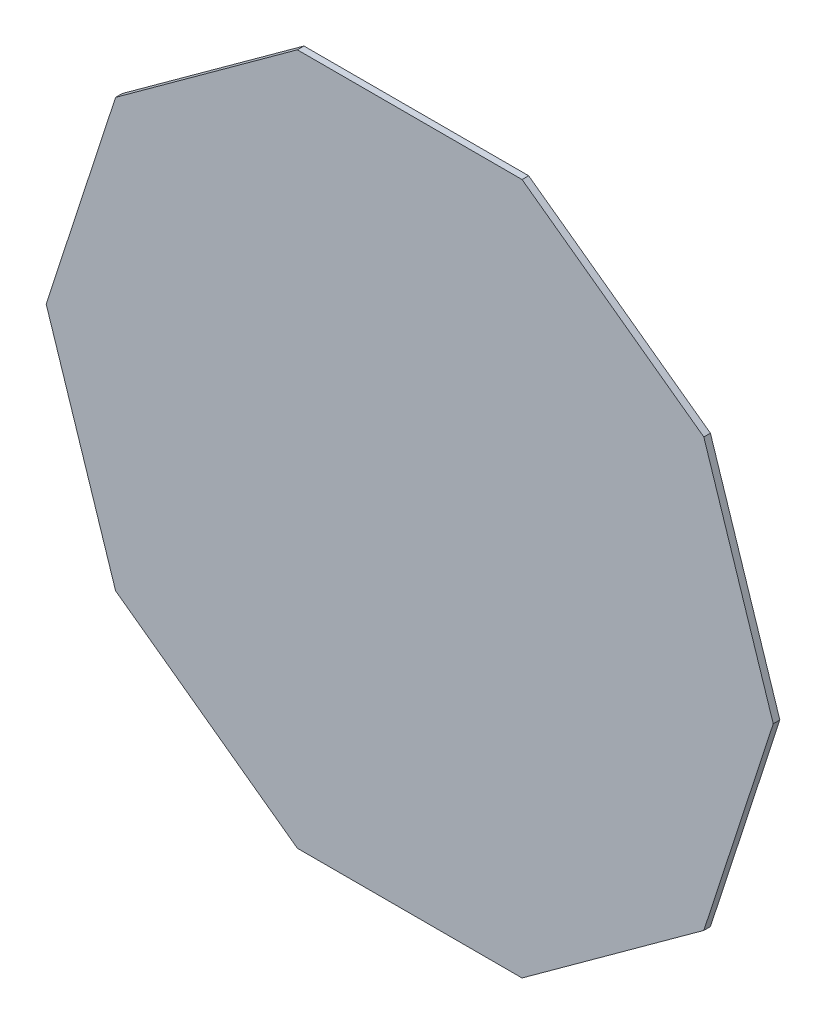
ISO-10303-21;
HEADER;
FILE_DESCRIPTION(('STEP AP214'),'2;1');
FILE_NAME('part.step','',(''),(''),'','','');
FILE_SCHEMA(('AUTOMOTIVE_DESIGN { 1 0 10303 214 1 1 1 1 }'));
ENDSEC;
DATA;
#1=APPLICATION_CONTEXT('core data for automotive mechanical design processes');
#2=APPLICATION_PROTOCOL_DEFINITION('international standard','automotive_design',2000,#1);
#3=PRODUCT_CONTEXT('',#1,'mechanical');
#4=PRODUCT('Part','Part','',(#3));
#5=PRODUCT_RELATED_PRODUCT_CATEGORY('part','',(#4));
#6=PRODUCT_DEFINITION_FORMATION('','',#4);
#7=PRODUCT_DEFINITION_CONTEXT('part definition',#1,'design');
#8=PRODUCT_DEFINITION('design','',#6,#7);
#9=PRODUCT_DEFINITION_SHAPE('','',#8);
#10=(LENGTH_UNIT() NAMED_UNIT(*) SI_UNIT(.MILLI.,.METRE.));
#11=(NAMED_UNIT(*) PLANE_ANGLE_UNIT() SI_UNIT($,.RADIAN.));
#12=(NAMED_UNIT(*) SI_UNIT($,.STERADIAN.) SOLID_ANGLE_UNIT());
#13=UNCERTAINTY_MEASURE_WITH_UNIT(LENGTH_MEASURE(1.E-05),#10,'distance_accuracy_value','');
#14=(GEOMETRIC_REPRESENTATION_CONTEXT(3) GLOBAL_UNCERTAINTY_ASSIGNED_CONTEXT((#13)) GLOBAL_UNIT_ASSIGNED_CONTEXT((#10,
#11,#12)) REPRESENTATION_CONTEXT('',''));
#15=CARTESIAN_POINT('',(0.,0.,0.));
#16=DIRECTION('',(0.,0.,1.));
#17=DIRECTION('',(1.,0.,0.));
#18=AXIS2_PLACEMENT_3D('',#15,#16,#17);
#19=CARTESIAN_POINT('',(5103.90485011227,-3708.20393249933,114.3));
#20=DIRECTION('',(-0.951056516295156,0.30901699437494,0.));
#21=DIRECTION('',(-0.30901699437494,-0.951056516295156,0.));
#22=AXIS2_PLACEMENT_3D('',#19,#20,#21);
#23=PLANE('',#22);
#24=DIRECTION('',(0.30901699437494,0.951056516295156,0.));
#25=VECTOR('',#24,1.);
#26=CARTESIAN_POINT('',(5103.90485011227,-3708.20393249933,0.));
#27=LINE('',#26,#25);
#28=CARTESIAN_POINT('',(5103.90485011227,-3708.20393249933,0.));
#29=VERTEX_POINT('',#28);
#30=CARTESIAN_POINT('',(6308.7733454296,4.70790727075829E-11,0.));
#31=VERTEX_POINT('',#30);
#32=EDGE_CURVE('E152',#29,#31,#27,.T.);
#33=ORIENTED_EDGE('',*,*,#32,.T.);
#34=DIRECTION('',(0.,0.,-1.));
#35=VECTOR('',#34,1.);
#36=CARTESIAN_POINT('',(6308.7733454296,4.70790727075829E-11,114.3));
#37=LINE('',#36,#35);
#38=CARTESIAN_POINT('',(6308.7733454296,4.70790727075829E-11,114.3));
#39=VERTEX_POINT('',#38);
#40=EDGE_CURVE('E11',#39,#31,#37,.T.);
#41=ORIENTED_EDGE('',*,*,#40,.F.);
#42=DIRECTION('',(0.30901699437494,0.951056516295156,0.));
#43=VECTOR('',#42,1.);
#44=CARTESIAN_POINT('',(5103.90485011227,-3708.20393249933,114.3));
#45=LINE('',#44,#43);
#46=CARTESIAN_POINT('',(5103.90485011227,-3708.20393249933,114.3));
#47=VERTEX_POINT('',#46);
#48=EDGE_CURVE('E180',#47,#39,#45,.T.);
#49=ORIENTED_EDGE('',*,*,#48,.F.);
#50=DIRECTION('',(0.,0.,-1.));
#51=VECTOR('',#50,1.);
#52=CARTESIAN_POINT('',(5103.90485011227,-3708.20393249933,114.3));
#53=LINE('',#52,#51);
#54=EDGE_CURVE('E148',#47,#29,#53,.T.);
#55=ORIENTED_EDGE('',*,*,#54,.T.);
#56=EDGE_LOOP('',(#33,#41,#49,#55));
#57=FACE_BOUND('',#56,.T.);
#58=ADVANCED_FACE('F39',(#57),#23,.F.);
#59=CARTESIAN_POINT('',(6308.7733454296,4.70790727075829E-11,114.3));
#60=DIRECTION('',(-0.951056516295151,-0.309016994374955,0.));
#61=DIRECTION('',(0.309016994374955,-0.951056516295151,0.));
#62=AXIS2_PLACEMENT_3D('',#59,#60,#61);
#63=PLANE('',#62);
#64=DIRECTION('',(-0.309016994374955,0.951056516295151,0.));
#65=VECTOR('',#64,1.);
#66=CARTESIAN_POINT('',(6308.7733454296,4.70790727075829E-11,0.));
#67=LINE('',#66,#65);
#68=CARTESIAN_POINT('',(5103.90485011221,3708.20393249941,0.));
#69=VERTEX_POINT('',#68);
#70=EDGE_CURVE('E156',#31,#69,#67,.T.);
#71=ORIENTED_EDGE('',*,*,#70,.T.);
#72=DIRECTION('',(0.,0.,-1.));
#73=VECTOR('',#72,1.);
#74=CARTESIAN_POINT('',(5103.90485011221,3708.20393249941,114.3));
#75=LINE('',#74,#73);
#76=CARTESIAN_POINT('',(5103.90485011221,3708.20393249941,114.3));
#77=VERTEX_POINT('',#76);
#78=EDGE_CURVE('E48',#77,#69,#75,.T.);
#79=ORIENTED_EDGE('',*,*,#78,.F.);
#80=DIRECTION('',(-0.309016994374955,0.951056516295151,0.));
#81=VECTOR('',#80,1.);
#82=CARTESIAN_POINT('',(6308.7733454296,4.70790727075829E-11,114.3));
#83=LINE('',#82,#81);
#84=EDGE_CURVE('E105',#39,#77,#83,.T.);
#85=ORIENTED_EDGE('',*,*,#84,.F.);
#86=ORIENTED_EDGE('',*,*,#40,.T.);
#87=EDGE_LOOP('',(#71,#79,#85,#86));
#88=FACE_BOUND('',#87,.T.);
#89=ADVANCED_FACE('F244',(#88),#63,.F.);
#90=CARTESIAN_POINT('',(5103.90485011221,3708.20393249941,114.3));
#91=DIRECTION('',(-0.587785252292467,-0.809016994374952,0.));
#92=DIRECTION('',(0.809016994374952,-0.587785252292467,0.));
#93=AXIS2_PLACEMENT_3D('',#90,#91,#92);
#94=PLANE('',#93);
#95=DIRECTION('',(-0.809016994374952,0.587785252292467,0.));
#96=VECTOR('',#95,1.);
#97=CARTESIAN_POINT('',(5103.90485011221,3708.20393249941,0.));
#98=LINE('',#97,#96);
#99=CARTESIAN_POINT('',(1949.5181773974,6000.00000000002,0.));
#100=VERTEX_POINT('',#99);
#101=EDGE_CURVE('E159',#69,#100,#98,.T.);
#102=ORIENTED_EDGE('',*,*,#101,.T.);
#103=DIRECTION('',(0.,0.,-1.));
#104=VECTOR('',#103,1.);
#105=CARTESIAN_POINT('',(1949.5181773974,6000.00000000002,114.3));
#106=LINE('',#105,#104);
#107=CARTESIAN_POINT('',(1949.5181773974,6000.00000000002,114.3));
#108=VERTEX_POINT('',#107);
#109=EDGE_CURVE('E199',#108,#100,#106,.T.);
#110=ORIENTED_EDGE('',*,*,#109,.F.);
#111=DIRECTION('',(-0.809016994374952,0.587785252292467,0.));
#112=VECTOR('',#111,1.);
#113=CARTESIAN_POINT('',(5103.90485011221,3708.20393249941,114.3));
#114=LINE('',#113,#112);
#115=EDGE_CURVE('E209',#77,#108,#114,.T.);
#116=ORIENTED_EDGE('',*,*,#115,.F.);
#117=ORIENTED_EDGE('',*,*,#78,.T.);
#118=EDGE_LOOP('',(#102,#110,#116,#117));
#119=FACE_BOUND('',#118,.T.);
#120=ADVANCED_FACE('F207',(#119),#94,.F.);
#121=CARTESIAN_POINT('',(1949.5181773974,6000.00000000002,114.3));
#122=DIRECTION('',(0.,-1.,0.));
#123=DIRECTION('',(1.,0.,0.));
#124=AXIS2_PLACEMENT_3D('',#121,#122,#123);
#125=PLANE('',#124);
#126=DIRECTION('',(-1.,0.,0.));
#127=VECTOR('',#126,1.);
#128=CARTESIAN_POINT('',(1949.5181773974,6000.00000000002,0.));
#129=LINE('',#128,#127);
#130=CARTESIAN_POINT('',(-1949.51817739748,5999.99999999998,0.));
#131=VERTEX_POINT('',#130);
#132=EDGE_CURVE('E162',#100,#131,#129,.T.);
#133=ORIENTED_EDGE('',*,*,#132,.T.);
#134=DIRECTION('',(0.,0.,-1.));
#135=VECTOR('',#134,1.);
#136=CARTESIAN_POINT('',(-1949.51817739748,5999.99999999998,114.3));
#137=LINE('',#136,#135);
#138=CARTESIAN_POINT('',(-1949.51817739748,5999.99999999998,114.3));
#139=VERTEX_POINT('',#138);
#140=EDGE_CURVE('E195',#139,#131,#137,.T.);
#141=ORIENTED_EDGE('',*,*,#140,.F.);
#142=DIRECTION('',(-1.,0.,0.));
#143=VECTOR('',#142,1.);
#144=CARTESIAN_POINT('',(1949.5181773974,6000.00000000002,114.3));
#145=LINE('',#144,#143);
#146=EDGE_CURVE('E228',#108,#139,#145,.T.);
#147=ORIENTED_EDGE('',*,*,#146,.F.);
#148=ORIENTED_EDGE('',*,*,#109,.T.);
#149=EDGE_LOOP('',(#133,#141,#147,#148));
#150=FACE_BOUND('',#149,.T.);
#151=ADVANCED_FACE('F218',(#150),#125,.F.);
#152=CARTESIAN_POINT('',(-1949.51817739748,5999.99999999998,114.3));
#153=DIRECTION('',(0.587785252292479,-0.809016994374943,0.));
#154=DIRECTION('',(0.809016994374943,0.587785252292479,0.));
#155=AXIS2_PLACEMENT_3D('',#152,#153,#154);
#156=PLANE('',#155);
#157=DIRECTION('',(-0.809016994374943,-0.587785252292479,0.));
#158=VECTOR('',#157,1.);
#159=CARTESIAN_POINT('',(-1949.51817739748,5999.99999999998,0.));
#160=LINE('',#159,#158);
#161=CARTESIAN_POINT('',(-5103.90485011227,3708.20393249933,0.));
#162=VERTEX_POINT('',#161);
#163=EDGE_CURVE('E165',#131,#162,#160,.T.);
#164=ORIENTED_EDGE('',*,*,#163,.T.);
#165=DIRECTION('',(0.,0.,-1.));
#166=VECTOR('',#165,1.);
#167=CARTESIAN_POINT('',(-5103.90485011227,3708.20393249933,114.3));
#168=LINE('',#167,#166);
#169=CARTESIAN_POINT('',(-5103.90485011227,3708.20393249933,114.3));
#170=VERTEX_POINT('',#169);
#171=EDGE_CURVE('E191',#170,#162,#168,.T.);
#172=ORIENTED_EDGE('',*,*,#171,.F.);
#173=DIRECTION('',(-0.809016994374943,-0.587785252292479,0.));
#174=VECTOR('',#173,1.);
#175=CARTESIAN_POINT('',(-1949.51817739748,5999.99999999998,114.3));
#176=LINE('',#175,#174);
#177=EDGE_CURVE('E224',#139,#170,#176,.T.);
#178=ORIENTED_EDGE('',*,*,#177,.F.);
#179=ORIENTED_EDGE('',*,*,#140,.T.);
#180=EDGE_LOOP('',(#164,#172,#178,#179));
#181=FACE_BOUND('',#180,.T.);
#182=ADVANCED_FACE('F222',(#181),#156,.F.);
#183=CARTESIAN_POINT('',(-5103.90485011227,3708.20393249933,114.3));
#184=DIRECTION('',(0.951056516295156,-0.30901699437494,0.));
#185=DIRECTION('',(0.30901699437494,0.951056516295156,0.));
#186=AXIS2_PLACEMENT_3D('',#183,#184,#185);
#187=PLANE('',#186);
#188=DIRECTION('',(-0.30901699437494,-0.951056516295156,0.));
#189=VECTOR('',#188,1.);
#190=CARTESIAN_POINT('',(-5103.90485011227,3708.20393249933,0.));
#191=LINE('',#190,#189);
#192=CARTESIAN_POINT('',(-6308.7733454296,-4.90235015299614E-11,0.));
#193=VERTEX_POINT('',#192);
#194=EDGE_CURVE('E168',#162,#193,#191,.T.);
#195=ORIENTED_EDGE('',*,*,#194,.T.);
#196=DIRECTION('',(0.,0.,-1.));
#197=VECTOR('',#196,1.);
#198=CARTESIAN_POINT('',(-6308.7733454296,-4.90235015299614E-11,114.3));
#199=LINE('',#198,#197);
#200=CARTESIAN_POINT('',(-6308.7733454296,-4.90235015299614E-11,114.3));
#201=VERTEX_POINT('',#200);
#202=EDGE_CURVE('E187',#201,#193,#199,.T.);
#203=ORIENTED_EDGE('',*,*,#202,.F.);
#204=DIRECTION('',(-0.30901699437494,-0.951056516295156,0.));
#205=VECTOR('',#204,1.);
#206=CARTESIAN_POINT('',(-5103.90485011227,3708.20393249933,114.3));
#207=LINE('',#206,#205);
#208=EDGE_CURVE('E227',#170,#201,#207,.T.);
#209=ORIENTED_EDGE('',*,*,#208,.F.);
#210=ORIENTED_EDGE('',*,*,#171,.T.);
#211=EDGE_LOOP('',(#195,#203,#209,#210));
#212=FACE_BOUND('',#211,.T.);
#213=ADVANCED_FACE('F256',(#212),#187,.F.);
#214=CARTESIAN_POINT('',(-6308.7733454296,-4.90235015299614E-11,114.3));
#215=DIRECTION('',(0.951056516295151,0.309016994374955,0.));
#216=DIRECTION('',(-0.309016994374955,0.951056516295151,0.));
#217=AXIS2_PLACEMENT_3D('',#214,#215,#216);
#218=PLANE('',#217);
#219=DIRECTION('',(0.309016994374954,-0.951056516295151,0.));
#220=VECTOR('',#219,1.);
#221=CARTESIAN_POINT('',(-6308.7733454296,-4.90235015299614E-11,0.));
#222=LINE('',#221,#220);
#223=CARTESIAN_POINT('',(-5103.90485011221,-3708.20393249941,0.));
#224=VERTEX_POINT('',#223);
#225=EDGE_CURVE('E171',#193,#224,#222,.T.);
#226=ORIENTED_EDGE('',*,*,#225,.T.);
#227=DIRECTION('',(0.,0.,-1.));
#228=VECTOR('',#227,1.);
#229=CARTESIAN_POINT('',(-5103.90485011221,-3708.20393249941,114.3));
#230=LINE('',#229,#228);
#231=CARTESIAN_POINT('',(-5103.90485011221,-3708.20393249941,114.3));
#232=VERTEX_POINT('',#231);
#233=EDGE_CURVE('E141',#232,#224,#230,.T.);
#234=ORIENTED_EDGE('',*,*,#233,.F.);
#235=DIRECTION('',(0.309016994374954,-0.951056516295151,0.));
#236=VECTOR('',#235,1.);
#237=CARTESIAN_POINT('',(-6308.7733454296,-4.90235015299614E-11,114.3));
#238=LINE('',#237,#236);
#239=EDGE_CURVE('E130',#201,#232,#238,.T.);
#240=ORIENTED_EDGE('',*,*,#239,.F.);
#241=ORIENTED_EDGE('',*,*,#202,.T.);
#242=EDGE_LOOP('',(#226,#234,#240,#241));
#243=FACE_BOUND('',#242,.T.);
#244=ADVANCED_FACE('F259',(#243),#218,.F.);
#245=CARTESIAN_POINT('',(-5103.90485011221,-3708.20393249941,114.3));
#246=DIRECTION('',(0.587785252292467,0.809016994374952,0.));
#247=DIRECTION('',(-0.809016994374952,0.587785252292467,0.));
#248=AXIS2_PLACEMENT_3D('',#245,#246,#247);
#249=PLANE('',#248);
#250=DIRECTION('',(0.809016994374952,-0.587785252292467,0.));
#251=VECTOR('',#250,1.);
#252=CARTESIAN_POINT('',(-5103.90485011221,-3708.20393249941,0.));
#253=LINE('',#252,#251);
#254=CARTESIAN_POINT('',(-1949.51817739739,-6000.00000000001,0.));
#255=VERTEX_POINT('',#254);
#256=EDGE_CURVE('E139',#224,#255,#253,.T.);
#257=ORIENTED_EDGE('',*,*,#256,.T.);
#258=DIRECTION('',(0.,0.,-1.));
#259=VECTOR('',#258,1.);
#260=CARTESIAN_POINT('',(-1949.51817739739,-6000.00000000001,114.3));
#261=LINE('',#260,#259);
#262=CARTESIAN_POINT('',(-1949.51817739739,-6000.00000000001,114.3));
#263=VERTEX_POINT('',#262);
#264=EDGE_CURVE('E136',#263,#255,#261,.T.);
#265=ORIENTED_EDGE('',*,*,#264,.F.);
#266=DIRECTION('',(0.809016994374952,-0.587785252292467,0.));
#267=VECTOR('',#266,1.);
#268=CARTESIAN_POINT('',(-5103.90485011221,-3708.20393249941,114.3));
#269=LINE('',#268,#267);
#270=EDGE_CURVE('E124',#232,#263,#269,.T.);
#271=ORIENTED_EDGE('',*,*,#270,.F.);
#272=ORIENTED_EDGE('',*,*,#233,.T.);
#273=EDGE_LOOP('',(#257,#265,#271,#272));
#274=FACE_BOUND('',#273,.T.);
#275=ADVANCED_FACE('F137',(#274),#249,.F.);
#276=CARTESIAN_POINT('',(-1949.51817739739,-6000.00000000001,114.3));
#277=DIRECTION('',(0.,1.,0.));
#278=DIRECTION('',(-1.,0.,0.));
#279=AXIS2_PLACEMENT_3D('',#276,#277,#278);
#280=PLANE('',#279);
#281=DIRECTION('',(1.,0.,0.));
#282=VECTOR('',#281,1.);
#283=CARTESIAN_POINT('',(-1949.51817739739,-6000.00000000001,0.));
#284=LINE('',#283,#282);
#285=CARTESIAN_POINT('',(1949.51817739748,-5999.99999999998,0.));
#286=VERTEX_POINT('',#285);
#287=EDGE_CURVE('E91',#255,#286,#284,.T.);
#288=ORIENTED_EDGE('',*,*,#287,.T.);
#289=DIRECTION('',(0.,0.,-1.));
#290=VECTOR('',#289,1.);
#291=CARTESIAN_POINT('',(1949.51817739748,-5999.99999999998,114.3));
#292=LINE('',#291,#290);
#293=CARTESIAN_POINT('',(1949.51817739748,-5999.99999999998,114.3));
#294=VERTEX_POINT('',#293);
#295=EDGE_CURVE('E142',#294,#286,#292,.T.);
#296=ORIENTED_EDGE('',*,*,#295,.F.);
#297=DIRECTION('',(1.,0.,0.));
#298=VECTOR('',#297,1.);
#299=CARTESIAN_POINT('',(-1949.51817739739,-6000.00000000001,114.3));
#300=LINE('',#299,#298);
#301=EDGE_CURVE('E128',#263,#294,#300,.T.);
#302=ORIENTED_EDGE('',*,*,#301,.F.);
#303=ORIENTED_EDGE('',*,*,#264,.T.);
#304=EDGE_LOOP('',(#288,#296,#302,#303));
#305=FACE_BOUND('',#304,.T.);
#306=ADVANCED_FACE('F144',(#305),#280,.F.);
#307=CARTESIAN_POINT('',(1949.51817739748,-5999.99999999998,114.3));
#308=DIRECTION('',(-0.587785252292479,0.809016994374943,0.));
#309=DIRECTION('',(-0.809016994374943,-0.587785252292479,0.));
#310=AXIS2_PLACEMENT_3D('',#307,#308,#309);
#311=PLANE('',#310);
#312=DIRECTION('',(0.809016994374943,0.587785252292479,0.));
#313=VECTOR('',#312,1.);
#314=CARTESIAN_POINT('',(1949.51817739748,-5999.99999999998,0.));
#315=LINE('',#314,#313);
#316=EDGE_CURVE('E97',#286,#29,#315,.T.);
#317=ORIENTED_EDGE('',*,*,#316,.T.);
#318=ORIENTED_EDGE('',*,*,#54,.F.);
#319=DIRECTION('',(0.809016994374943,0.587785252292479,0.));
#320=VECTOR('',#319,1.);
#321=CARTESIAN_POINT('',(1949.51817739748,-5999.99999999998,114.3));
#322=LINE('',#321,#320);
#323=EDGE_CURVE('E56',#294,#47,#322,.T.);
#324=ORIENTED_EDGE('',*,*,#323,.F.);
#325=ORIENTED_EDGE('',*,*,#295,.T.);
#326=EDGE_LOOP('',(#317,#318,#324,#325));
#327=FACE_BOUND('',#326,.T.);
#328=ADVANCED_FACE('F268',(#327),#311,.F.);
#329=CARTESIAN_POINT('',(0.,0.,114.3));
#330=DIRECTION('',(0.,0.,1.));
#331=DIRECTION('',(1.,0.,0.));
#332=AXIS2_PLACEMENT_3D('',#329,#330,#331);
#333=PLANE('',#332);
#334=ORIENTED_EDGE('',*,*,#48,.T.);
#335=ORIENTED_EDGE('',*,*,#84,.T.);
#336=ORIENTED_EDGE('',*,*,#115,.T.);
#337=ORIENTED_EDGE('',*,*,#146,.T.);
#338=ORIENTED_EDGE('',*,*,#177,.T.);
#339=ORIENTED_EDGE('',*,*,#208,.T.);
#340=ORIENTED_EDGE('',*,*,#239,.T.);
#341=ORIENTED_EDGE('',*,*,#270,.T.);
#342=ORIENTED_EDGE('',*,*,#301,.T.);
#343=ORIENTED_EDGE('',*,*,#323,.T.);
#344=EDGE_LOOP('',(#334,#335,#336,#337,#338,#339,#340,#341,#342,#343));
#345=FACE_BOUND('',#344,.T.);
#346=ADVANCED_FACE('F126',(#345),#333,.T.);
#347=CARTESIAN_POINT('',(0.,0.,0.));
#348=DIRECTION('',(0.,0.,1.));
#349=DIRECTION('',(1.,0.,0.));
#350=AXIS2_PLACEMENT_3D('',#347,#348,#349);
#351=PLANE('',#350);
#352=ORIENTED_EDGE('',*,*,#32,.F.);
#353=ORIENTED_EDGE('',*,*,#316,.F.);
#354=ORIENTED_EDGE('',*,*,#287,.F.);
#355=ORIENTED_EDGE('',*,*,#256,.F.);
#356=ORIENTED_EDGE('',*,*,#225,.F.);
#357=ORIENTED_EDGE('',*,*,#194,.F.);
#358=ORIENTED_EDGE('',*,*,#163,.F.);
#359=ORIENTED_EDGE('',*,*,#132,.F.);
#360=ORIENTED_EDGE('',*,*,#101,.F.);
#361=ORIENTED_EDGE('',*,*,#70,.F.);
#362=EDGE_LOOP('',(#352,#353,#354,#355,#356,#357,#358,#359,#360,#361));
#363=FACE_BOUND('',#362,.T.);
#364=ADVANCED_FACE('F213',(#363),#351,.F.);
#365=CLOSED_SHELL('',(#58,#89,#120,#151,#182,#213,#244,#275,#306,#328,#346,#364));
#366=MANIFOLD_SOLID_BREP('B2',#365);
#367=ADVANCED_BREP_SHAPE_REPRESENTATION('',(#18,#366),#14);
#368=SHAPE_DEFINITION_REPRESENTATION(#9,#367);
ENDSEC;
END-ISO-10303-21;
